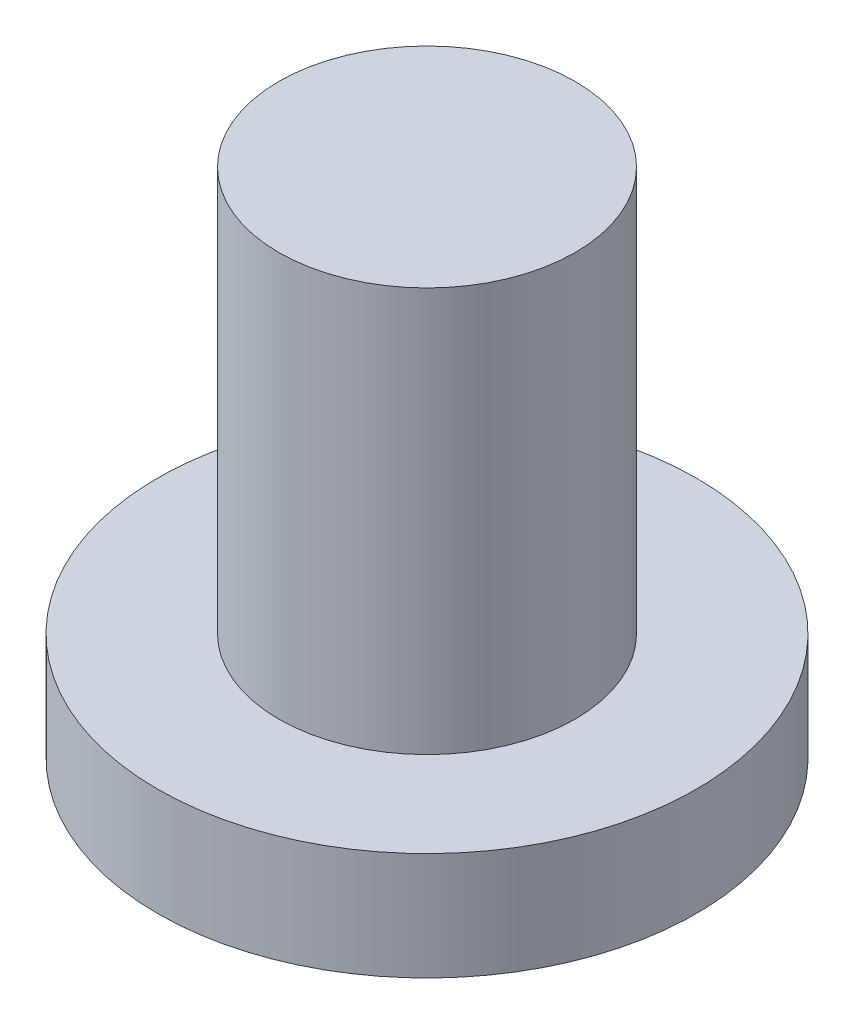
ISO-10303-21;
HEADER;
FILE_DESCRIPTION(('STEP AP214'),'2;1');
FILE_NAME('part.step','',(''),(''),'','','');
FILE_SCHEMA(('AUTOMOTIVE_DESIGN { 1 0 10303 214 1 1 1 1 }'));
ENDSEC;
DATA;
#1=APPLICATION_CONTEXT('core data for automotive mechanical design processes');
#2=APPLICATION_PROTOCOL_DEFINITION('international standard','automotive_design',2000,#1);
#3=PRODUCT_CONTEXT('',#1,'mechanical');
#4=PRODUCT('Part','Part','',(#3));
#5=PRODUCT_RELATED_PRODUCT_CATEGORY('part','',(#4));
#6=PRODUCT_DEFINITION_FORMATION('','',#4);
#7=PRODUCT_DEFINITION_CONTEXT('part definition',#1,'design');
#8=PRODUCT_DEFINITION('design','',#6,#7);
#9=PRODUCT_DEFINITION_SHAPE('','',#8);
#10=(LENGTH_UNIT() NAMED_UNIT(*) SI_UNIT(.MILLI.,.METRE.));
#11=(NAMED_UNIT(*) PLANE_ANGLE_UNIT() SI_UNIT($,.RADIAN.));
#12=(NAMED_UNIT(*) SI_UNIT($,.STERADIAN.) SOLID_ANGLE_UNIT());
#13=UNCERTAINTY_MEASURE_WITH_UNIT(LENGTH_MEASURE(1.E-05),#10,'distance_accuracy_value','');
#14=(GEOMETRIC_REPRESENTATION_CONTEXT(3) GLOBAL_UNCERTAINTY_ASSIGNED_CONTEXT((#13)) GLOBAL_UNIT_ASSIGNED_CONTEXT((#10,
#11,#12)) REPRESENTATION_CONTEXT('',''));
#15=CARTESIAN_POINT('',(0.,0.,0.));
#16=DIRECTION('',(0.,0.,1.));
#17=DIRECTION('',(1.,0.,0.));
#18=AXIS2_PLACEMENT_3D('',#15,#16,#17);
#19=CARTESIAN_POINT('',(0.,0.8,0.));
#20=DIRECTION('',(0.,-1.,0.));
#21=DIRECTION('',(0.,0.,-1.));
#22=AXIS2_PLACEMENT_3D('',#19,#20,#21);
#23=CYLINDRICAL_SURFACE('',#22,2.);
#24=CARTESIAN_POINT('',(0.,0.8,0.));
#25=DIRECTION('',(0.,1.,0.));
#26=DIRECTION('',(0.,0.,1.));
#27=AXIS2_PLACEMENT_3D('',#24,#25,#26);
#28=CIRCLE('',#27,2.);
#29=CARTESIAN_POINT('',(0.,0.8,2.));
#30=VERTEX_POINT('',#29);
#31=EDGE_CURVE('E10',#30,#30,#28,.T.);
#32=ORIENTED_EDGE('',*,*,#31,.F.);
#33=EDGE_LOOP('',(#32));
#34=FACE_BOUND('',#33,.T.);
#35=CARTESIAN_POINT('',(0.,0.,0.));
#36=DIRECTION('',(0.,1.,0.));
#37=DIRECTION('',(0.,0.,1.));
#38=AXIS2_PLACEMENT_3D('',#35,#36,#37);
#39=CIRCLE('',#38,2.);
#40=CARTESIAN_POINT('',(0.,0.,2.));
#41=VERTEX_POINT('',#40);
#42=EDGE_CURVE('E33',#41,#41,#39,.T.);
#43=ORIENTED_EDGE('',*,*,#42,.T.);
#44=EDGE_LOOP('',(#43));
#45=FACE_BOUND('',#44,.T.);
#46=ADVANCED_FACE('F30',(#34,#45),#23,.T.);
#47=CARTESIAN_POINT('',(0.,0.8,0.));
#48=DIRECTION('',(0.,1.,0.));
#49=DIRECTION('',(0.,0.,1.));
#50=AXIS2_PLACEMENT_3D('',#47,#48,#49);
#51=PLANE('',#50);
#52=CARTESIAN_POINT('',(0.,0.8,0.));
#53=DIRECTION('',(0.,1.,0.));
#54=DIRECTION('',(0.,0.,1.));
#55=AXIS2_PLACEMENT_3D('',#52,#53,#54);
#56=CIRCLE('',#55,1.1);
#57=CARTESIAN_POINT('',(0.,0.8,1.1));
#58=VERTEX_POINT('',#57);
#59=EDGE_CURVE('E42',#58,#58,#56,.T.);
#60=ORIENTED_EDGE('',*,*,#59,.F.);
#61=EDGE_LOOP('',(#60));
#62=FACE_BOUND('',#61,.T.);
#63=ORIENTED_EDGE('',*,*,#31,.T.);
#64=EDGE_LOOP('',(#63));
#65=FACE_BOUND('',#64,.T.);
#66=ADVANCED_FACE('F57',(#62,#65),#51,.T.);
#67=CARTESIAN_POINT('',(0.,0.,0.));
#68=DIRECTION('',(0.,1.,0.));
#69=DIRECTION('',(0.,0.,1.));
#70=AXIS2_PLACEMENT_3D('',#67,#68,#69);
#71=PLANE('',#70);
#72=ORIENTED_EDGE('',*,*,#42,.F.);
#73=EDGE_LOOP('',(#72));
#74=FACE_BOUND('',#73,.T.);
#75=ADVANCED_FACE('F53',(#74),#71,.F.);
#76=CARTESIAN_POINT('',(0.,3.8,0.));
#77=DIRECTION('',(0.,-1.,0.));
#78=DIRECTION('',(0.,0.,-1.));
#79=AXIS2_PLACEMENT_3D('',#76,#77,#78);
#80=CYLINDRICAL_SURFACE('',#79,1.1);
#81=CARTESIAN_POINT('',(0.,3.8,0.));
#82=DIRECTION('',(0.,1.,0.));
#83=DIRECTION('',(0.,0.,1.));
#84=AXIS2_PLACEMENT_3D('',#81,#82,#83);
#85=CIRCLE('',#84,1.1);
#86=CARTESIAN_POINT('',(0.,3.8,1.1));
#87=VERTEX_POINT('',#86);
#88=EDGE_CURVE('E40',#87,#87,#85,.T.);
#89=ORIENTED_EDGE('',*,*,#88,.F.);
#90=EDGE_LOOP('',(#89));
#91=FACE_BOUND('',#90,.T.);
#92=ORIENTED_EDGE('',*,*,#59,.T.);
#93=EDGE_LOOP('',(#92));
#94=FACE_BOUND('',#93,.T.);
#95=ADVANCED_FACE('F50',(#91,#94),#80,.T.);
#96=CARTESIAN_POINT('',(0.,3.8,0.));
#97=DIRECTION('',(0.,1.,0.));
#98=DIRECTION('',(0.,0.,1.));
#99=AXIS2_PLACEMENT_3D('',#96,#97,#98);
#100=PLANE('',#99);
#101=ORIENTED_EDGE('',*,*,#88,.T.);
#102=EDGE_LOOP('',(#101));
#103=FACE_BOUND('',#102,.T.);
#104=ADVANCED_FACE('F48',(#103),#100,.T.);
#105=CLOSED_SHELL('',(#46,#66,#75,#95,#104));
#106=MANIFOLD_SOLID_BREP('B2',#105);
#107=ADVANCED_BREP_SHAPE_REPRESENTATION('',(#18,#106),#14);
#108=SHAPE_DEFINITION_REPRESENTATION(#9,#107);
ENDSEC;
END-ISO-10303-21;
